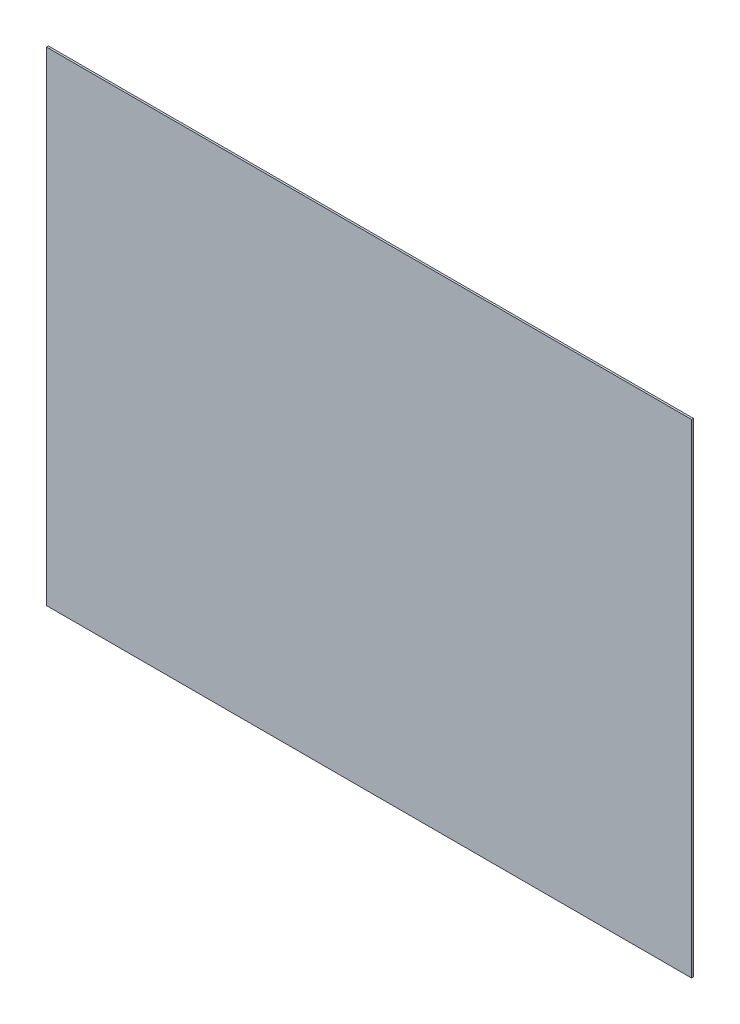
ISO-10303-21;
HEADER;
FILE_DESCRIPTION(('STEP AP214'),'2;1');
FILE_NAME('part.step','',(''),(''),'','','');
FILE_SCHEMA(('AUTOMOTIVE_DESIGN { 1 0 10303 214 1 1 1 1 }'));
ENDSEC;
DATA;
#1=APPLICATION_CONTEXT('core data for automotive mechanical design processes');
#2=APPLICATION_PROTOCOL_DEFINITION('international standard','automotive_design',2000,#1);
#3=PRODUCT_CONTEXT('',#1,'mechanical');
#4=PRODUCT('Part','Part','',(#3));
#5=PRODUCT_RELATED_PRODUCT_CATEGORY('part','',(#4));
#6=PRODUCT_DEFINITION_FORMATION('','',#4);
#7=PRODUCT_DEFINITION_CONTEXT('part definition',#1,'design');
#8=PRODUCT_DEFINITION('design','',#6,#7);
#9=PRODUCT_DEFINITION_SHAPE('','',#8);
#10=(LENGTH_UNIT() NAMED_UNIT(*) SI_UNIT(.MILLI.,.METRE.));
#11=(NAMED_UNIT(*) PLANE_ANGLE_UNIT() SI_UNIT($,.RADIAN.));
#12=(NAMED_UNIT(*) SI_UNIT($,.STERADIAN.) SOLID_ANGLE_UNIT());
#13=UNCERTAINTY_MEASURE_WITH_UNIT(LENGTH_MEASURE(1.E-05),#10,'distance_accuracy_value','');
#14=(GEOMETRIC_REPRESENTATION_CONTEXT(3) GLOBAL_UNCERTAINTY_ASSIGNED_CONTEXT((#13)) GLOBAL_UNIT_ASSIGNED_CONTEXT((#10,
#11,#12)) REPRESENTATION_CONTEXT('',''));
#15=CARTESIAN_POINT('',(0.,0.,0.));
#16=DIRECTION('',(0.,0.,1.));
#17=DIRECTION('',(1.,0.,0.));
#18=AXIS2_PLACEMENT_3D('',#15,#16,#17);
#19=CARTESIAN_POINT('',(200.,150.,1.2));
#20=DIRECTION('',(-1.,0.,0.));
#21=DIRECTION('',(0.,-1.,0.));
#22=AXIS2_PLACEMENT_3D('',#19,#20,#21);
#23=PLANE('',#22);
#24=DIRECTION('',(0.,1.,0.));
#25=VECTOR('',#24,1.);
#26=CARTESIAN_POINT('',(200.,150.,0.));
#27=LINE('',#26,#25);
#28=CARTESIAN_POINT('',(200.,-150.,0.));
#29=VERTEX_POINT('',#28);
#30=CARTESIAN_POINT('',(200.,150.,0.));
#31=VERTEX_POINT('',#30);
#32=EDGE_CURVE('E96',#29,#31,#27,.T.);
#33=ORIENTED_EDGE('',*,*,#32,.T.);
#34=DIRECTION('',(0.,0.,-1.));
#35=VECTOR('',#34,1.);
#36=CARTESIAN_POINT('',(200.,150.,1.2));
#37=LINE('',#36,#35);
#38=CARTESIAN_POINT('',(200.,150.,1.2));
#39=VERTEX_POINT('',#38);
#40=EDGE_CURVE('E11',#39,#31,#37,.T.);
#41=ORIENTED_EDGE('',*,*,#40,.F.);
#42=DIRECTION('',(0.,1.,0.));
#43=VECTOR('',#42,1.);
#44=CARTESIAN_POINT('',(200.,150.,1.2));
#45=LINE('',#44,#43);
#46=CARTESIAN_POINT('',(200.,-150.,1.2));
#47=VERTEX_POINT('',#46);
#48=EDGE_CURVE('E84',#47,#39,#45,.T.);
#49=ORIENTED_EDGE('',*,*,#48,.F.);
#50=DIRECTION('',(0.,0.,-1.));
#51=VECTOR('',#50,1.);
#52=CARTESIAN_POINT('',(200.,-150.,1.2));
#53=LINE('',#52,#51);
#54=EDGE_CURVE('E92',#47,#29,#53,.T.);
#55=ORIENTED_EDGE('',*,*,#54,.T.);
#56=EDGE_LOOP('',(#33,#41,#49,#55));
#57=FACE_BOUND('',#56,.T.);
#58=ADVANCED_FACE('F33',(#57),#23,.F.);
#59=CARTESIAN_POINT('',(-200.,150.,1.2));
#60=DIRECTION('',(0.,-1.,0.));
#61=DIRECTION('',(0.,0.,-1.));
#62=AXIS2_PLACEMENT_3D('',#59,#60,#61);
#63=PLANE('',#62);
#64=DIRECTION('',(-1.,0.,0.));
#65=VECTOR('',#64,1.);
#66=CARTESIAN_POINT('',(-200.,150.,0.));
#67=LINE('',#66,#65);
#68=CARTESIAN_POINT('',(-200.,150.,0.));
#69=VERTEX_POINT('',#68);
#70=EDGE_CURVE('E88',#31,#69,#67,.T.);
#71=ORIENTED_EDGE('',*,*,#70,.T.);
#72=DIRECTION('',(0.,0.,-1.));
#73=VECTOR('',#72,1.);
#74=CARTESIAN_POINT('',(-200.,150.,1.2));
#75=LINE('',#74,#73);
#76=CARTESIAN_POINT('',(-200.,150.,1.2));
#77=VERTEX_POINT('',#76);
#78=EDGE_CURVE('E41',#77,#69,#75,.T.);
#79=ORIENTED_EDGE('',*,*,#78,.F.);
#80=DIRECTION('',(-1.,0.,0.));
#81=VECTOR('',#80,1.);
#82=CARTESIAN_POINT('',(-200.,150.,1.2));
#83=LINE('',#82,#81);
#84=EDGE_CURVE('E79',#39,#77,#83,.T.);
#85=ORIENTED_EDGE('',*,*,#84,.F.);
#86=ORIENTED_EDGE('',*,*,#40,.T.);
#87=EDGE_LOOP('',(#71,#79,#85,#86));
#88=FACE_BOUND('',#87,.T.);
#89=ADVANCED_FACE('F87',(#88),#63,.F.);
#90=CARTESIAN_POINT('',(-200.,150.,1.2));
#91=DIRECTION('',(1.,0.,0.));
#92=DIRECTION('',(0.,1.,0.));
#93=AXIS2_PLACEMENT_3D('',#90,#91,#92);
#94=PLANE('',#93);
#95=DIRECTION('',(0.,-1.,0.));
#96=VECTOR('',#95,1.);
#97=CARTESIAN_POINT('',(-200.,150.,0.));
#98=LINE('',#97,#96);
#99=CARTESIAN_POINT('',(-200.,-150.,0.));
#100=VERTEX_POINT('',#99);
#101=EDGE_CURVE('E66',#69,#100,#98,.T.);
#102=ORIENTED_EDGE('',*,*,#101,.T.);
#103=DIRECTION('',(0.,0.,-1.));
#104=VECTOR('',#103,1.);
#105=CARTESIAN_POINT('',(-200.,-150.,1.2));
#106=LINE('',#105,#104);
#107=CARTESIAN_POINT('',(-200.,-150.,1.2));
#108=VERTEX_POINT('',#107);
#109=EDGE_CURVE('E89',#108,#100,#106,.T.);
#110=ORIENTED_EDGE('',*,*,#109,.F.);
#111=DIRECTION('',(0.,-1.,0.));
#112=VECTOR('',#111,1.);
#113=CARTESIAN_POINT('',(-200.,150.,1.2));
#114=LINE('',#113,#112);
#115=EDGE_CURVE('E82',#77,#108,#114,.T.);
#116=ORIENTED_EDGE('',*,*,#115,.F.);
#117=ORIENTED_EDGE('',*,*,#78,.T.);
#118=EDGE_LOOP('',(#102,#110,#116,#117));
#119=FACE_BOUND('',#118,.T.);
#120=ADVANCED_FACE('F90',(#119),#94,.F.);
#121=CARTESIAN_POINT('',(-200.,-150.,1.2));
#122=DIRECTION('',(0.,1.,0.));
#123=DIRECTION('',(0.,0.,1.));
#124=AXIS2_PLACEMENT_3D('',#121,#122,#123);
#125=PLANE('',#124);
#126=DIRECTION('',(1.,0.,0.));
#127=VECTOR('',#126,1.);
#128=CARTESIAN_POINT('',(-200.,-150.,0.));
#129=LINE('',#128,#127);
#130=EDGE_CURVE('E72',#100,#29,#129,.T.);
#131=ORIENTED_EDGE('',*,*,#130,.T.);
#132=ORIENTED_EDGE('',*,*,#54,.F.);
#133=DIRECTION('',(1.,0.,0.));
#134=VECTOR('',#133,1.);
#135=CARTESIAN_POINT('',(-200.,-150.,1.2));
#136=LINE('',#135,#134);
#137=EDGE_CURVE('E49',#108,#47,#136,.T.);
#138=ORIENTED_EDGE('',*,*,#137,.F.);
#139=ORIENTED_EDGE('',*,*,#109,.T.);
#140=EDGE_LOOP('',(#131,#132,#138,#139));
#141=FACE_BOUND('',#140,.T.);
#142=ADVANCED_FACE('F103',(#141),#125,.F.);
#143=CARTESIAN_POINT('',(0.,0.,1.2));
#144=DIRECTION('',(0.,0.,1.));
#145=DIRECTION('',(1.,0.,0.));
#146=AXIS2_PLACEMENT_3D('',#143,#144,#145);
#147=PLANE('',#146);
#148=ORIENTED_EDGE('',*,*,#48,.T.);
#149=ORIENTED_EDGE('',*,*,#84,.T.);
#150=ORIENTED_EDGE('',*,*,#115,.T.);
#151=ORIENTED_EDGE('',*,*,#137,.T.);
#152=EDGE_LOOP('',(#148,#149,#150,#151));
#153=FACE_BOUND('',#152,.T.);
#154=ADVANCED_FACE('F80',(#153),#147,.T.);
#155=CARTESIAN_POINT('',(0.,0.,0.));
#156=DIRECTION('',(0.,0.,1.));
#157=DIRECTION('',(1.,0.,0.));
#158=AXIS2_PLACEMENT_3D('',#155,#156,#157);
#159=PLANE('',#158);
#160=ORIENTED_EDGE('',*,*,#32,.F.);
#161=ORIENTED_EDGE('',*,*,#130,.F.);
#162=ORIENTED_EDGE('',*,*,#101,.F.);
#163=ORIENTED_EDGE('',*,*,#70,.F.);
#164=EDGE_LOOP('',(#160,#161,#162,#163));
#165=FACE_BOUND('',#164,.T.);
#166=ADVANCED_FACE('F106',(#165),#159,.F.);
#167=CLOSED_SHELL('',(#58,#89,#120,#142,#154,#166));
#168=MANIFOLD_SOLID_BREP('B2',#167);
#169=ADVANCED_BREP_SHAPE_REPRESENTATION('',(#18,#168),#14);
#170=SHAPE_DEFINITION_REPRESENTATION(#9,#169);
ENDSEC;
END-ISO-10303-21;
